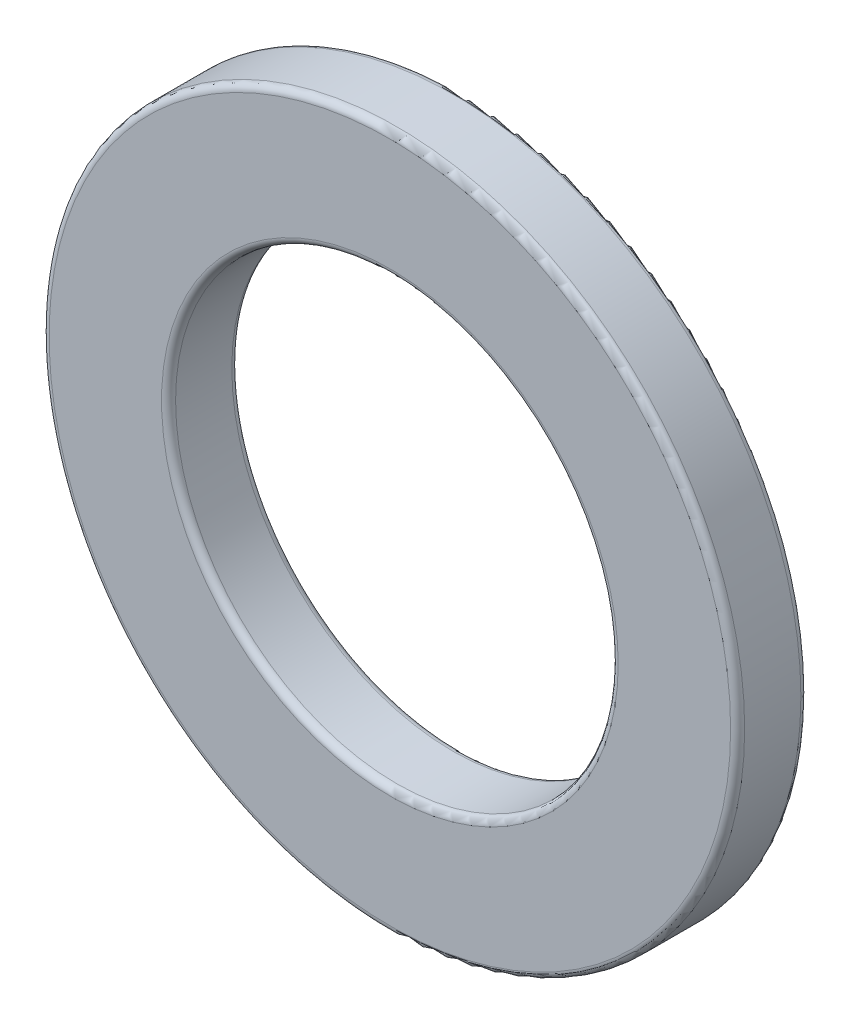
ISO-10303-21;
HEADER;
FILE_DESCRIPTION(('STEP AP214'),'2;1');
FILE_NAME('part.step','',(''),(''),'','','');
FILE_SCHEMA(('AUTOMOTIVE_DESIGN { 1 0 10303 214 1 1 1 1 }'));
ENDSEC;
DATA;
#1=APPLICATION_CONTEXT('core data for automotive mechanical design processes');
#2=APPLICATION_PROTOCOL_DEFINITION('international standard','automotive_design',2000,#1);
#3=PRODUCT_CONTEXT('',#1,'mechanical');
#4=PRODUCT('Part','Part','',(#3));
#5=PRODUCT_RELATED_PRODUCT_CATEGORY('part','',(#4));
#6=PRODUCT_DEFINITION_FORMATION('','',#4);
#7=PRODUCT_DEFINITION_CONTEXT('part definition',#1,'design');
#8=PRODUCT_DEFINITION('design','',#6,#7);
#9=PRODUCT_DEFINITION_SHAPE('','',#8);
#10=(LENGTH_UNIT() NAMED_UNIT(*) SI_UNIT(.MILLI.,.METRE.));
#11=(NAMED_UNIT(*) PLANE_ANGLE_UNIT() SI_UNIT($,.RADIAN.));
#12=(NAMED_UNIT(*) SI_UNIT($,.STERADIAN.) SOLID_ANGLE_UNIT());
#13=UNCERTAINTY_MEASURE_WITH_UNIT(LENGTH_MEASURE(1.E-05),#10,'distance_accuracy_value','');
#14=(GEOMETRIC_REPRESENTATION_CONTEXT(3) GLOBAL_UNCERTAINTY_ASSIGNED_CONTEXT((#13)) GLOBAL_UNIT_ASSIGNED_CONTEXT((#10,
#11,#12)) REPRESENTATION_CONTEXT('',''));
#15=CARTESIAN_POINT('',(0.,0.,0.));
#16=DIRECTION('',(0.,0.,1.));
#17=DIRECTION('',(1.,0.,0.));
#18=AXIS2_PLACEMENT_3D('',#15,#16,#17);
#19=CARTESIAN_POINT('',(0.,0.,0.5));
#20=DIRECTION('',(0.,0.,1.));
#21=DIRECTION('',(1.,0.,0.));
#22=AXIS2_PLACEMENT_3D('',#19,#20,#21);
#23=PLANE('',#22);
#24=CARTESIAN_POINT('',(0.,0.,0.5));
#25=DIRECTION('',(0.,0.,1.));
#26=DIRECTION('',(1.,0.,0.));
#27=AXIS2_PLACEMENT_3D('',#24,#25,#26);
#28=CIRCLE('',#27,1.625);
#29=CARTESIAN_POINT('',(1.625,0.,0.5));
#30=VERTEX_POINT('',#29);
#31=EDGE_CURVE('E10',#30,#30,#28,.F.);
#32=ORIENTED_EDGE('',*,*,#31,.T.);
#33=EDGE_LOOP('',(#32));
#34=FACE_BOUND('',#33,.T.);
#35=CARTESIAN_POINT('',(0.,0.,0.5));
#36=DIRECTION('',(0.,0.,1.));
#37=DIRECTION('',(1.,0.,0.));
#38=AXIS2_PLACEMENT_3D('',#35,#36,#37);
#39=CIRCLE('',#38,2.425);
#40=CARTESIAN_POINT('',(2.425,0.,0.5));
#41=VERTEX_POINT('',#40);
#42=EDGE_CURVE('E39',#41,#41,#39,.T.);
#43=ORIENTED_EDGE('',*,*,#42,.T.);
#44=EDGE_LOOP('',(#43));
#45=FACE_BOUND('',#44,.T.);
#46=ADVANCED_FACE('F32',(#34,#45),#23,.T.);
#47=CARTESIAN_POINT('',(0.,0.,0.));
#48=DIRECTION('',(0.,0.,1.));
#49=DIRECTION('',(1.,0.,0.));
#50=AXIS2_PLACEMENT_3D('',#47,#48,#49);
#51=PLANE('',#50);
#52=CARTESIAN_POINT('',(0.,0.,0.));
#53=DIRECTION('',(0.,0.,1.));
#54=DIRECTION('',(1.,0.,0.));
#55=AXIS2_PLACEMENT_3D('',#52,#53,#54);
#56=CIRCLE('',#55,1.625);
#57=CARTESIAN_POINT('',(1.625,0.,0.));
#58=VERTEX_POINT('',#57);
#59=EDGE_CURVE('E58',#58,#58,#56,.T.);
#60=ORIENTED_EDGE('',*,*,#59,.T.);
#61=EDGE_LOOP('',(#60));
#62=FACE_BOUND('',#61,.T.);
#63=CARTESIAN_POINT('',(0.,0.,0.));
#64=DIRECTION('',(0.,0.,1.));
#65=DIRECTION('',(1.,0.,0.));
#66=AXIS2_PLACEMENT_3D('',#63,#64,#65);
#67=CIRCLE('',#66,2.425);
#68=CARTESIAN_POINT('',(2.425,0.,0.));
#69=VERTEX_POINT('',#68);
#70=EDGE_CURVE('E61',#69,#69,#67,.F.);
#71=ORIENTED_EDGE('',*,*,#70,.T.);
#72=EDGE_LOOP('',(#71));
#73=FACE_BOUND('',#72,.T.);
#74=ADVANCED_FACE('F65',(#62,#73),#51,.F.);
#75=CARTESIAN_POINT('',(0.,0.,0.5));
#76=DIRECTION('',(0.,0.,-1.));
#77=DIRECTION('',(-1.,0.,0.));
#78=AXIS2_PLACEMENT_3D('',#75,#76,#77);
#79=CYLINDRICAL_SURFACE('',#78,2.475);
#80=CARTESIAN_POINT('',(0.,0.,0.05));
#81=DIRECTION('',(0.,0.,1.));
#82=DIRECTION('',(1.,0.,0.));
#83=AXIS2_PLACEMENT_3D('',#80,#81,#82);
#84=CIRCLE('',#83,2.475);
#85=CARTESIAN_POINT('',(2.475,0.,0.05));
#86=VERTEX_POINT('',#85);
#87=EDGE_CURVE('E43',#86,#86,#84,.T.);
#88=ORIENTED_EDGE('',*,*,#87,.T.);
#89=EDGE_LOOP('',(#88));
#90=FACE_BOUND('',#89,.T.);
#91=CARTESIAN_POINT('',(0.,0.,0.45));
#92=DIRECTION('',(0.,0.,1.));
#93=DIRECTION('',(1.,0.,0.));
#94=AXIS2_PLACEMENT_3D('',#91,#92,#93);
#95=CIRCLE('',#94,2.475);
#96=CARTESIAN_POINT('',(2.475,0.,0.45));
#97=VERTEX_POINT('',#96);
#98=EDGE_CURVE('E47',#97,#97,#95,.F.);
#99=ORIENTED_EDGE('',*,*,#98,.T.);
#100=EDGE_LOOP('',(#99));
#101=FACE_BOUND('',#100,.T.);
#102=ADVANCED_FACE('F75',(#90,#101),#79,.T.);
#103=CARTESIAN_POINT('',(0.,0.,0.5));
#104=DIRECTION('',(0.,0.,-1.));
#105=DIRECTION('',(-1.,0.,0.));
#106=AXIS2_PLACEMENT_3D('',#103,#104,#105);
#107=CYLINDRICAL_SURFACE('',#106,1.575);
#108=CARTESIAN_POINT('',(0.,0.,0.05));
#109=DIRECTION('',(0.,0.,1.));
#110=DIRECTION('',(1.,0.,0.));
#111=AXIS2_PLACEMENT_3D('',#108,#109,#110);
#112=CIRCLE('',#111,1.575);
#113=CARTESIAN_POINT('',(1.575,0.,0.05));
#114=VERTEX_POINT('',#113);
#115=EDGE_CURVE('E52',#114,#114,#112,.F.);
#116=ORIENTED_EDGE('',*,*,#115,.T.);
#117=EDGE_LOOP('',(#116));
#118=FACE_BOUND('',#117,.T.);
#119=CARTESIAN_POINT('',(0.,0.,0.45));
#120=DIRECTION('',(0.,0.,1.));
#121=DIRECTION('',(1.,0.,0.));
#122=AXIS2_PLACEMENT_3D('',#119,#120,#121);
#123=CIRCLE('',#122,1.575);
#124=CARTESIAN_POINT('',(1.575,0.,0.45));
#125=VERTEX_POINT('',#124);
#126=EDGE_CURVE('E55',#125,#125,#123,.T.);
#127=ORIENTED_EDGE('',*,*,#126,.T.);
#128=EDGE_LOOP('',(#127));
#129=FACE_BOUND('',#128,.T.);
#130=ADVANCED_FACE('F78',(#118,#129),#107,.F.);
#131=CARTESIAN_POINT('',(0.,0.,0.05));
#132=DIRECTION('',(0.,0.,1.));
#133=DIRECTION('',(1.,0.,0.));
#134=AXIS2_PLACEMENT_3D('',#131,#132,#133);
#135=TOROIDAL_SURFACE('',#134,1.625,0.05);
#136=ORIENTED_EDGE('',*,*,#115,.F.);
#137=EDGE_LOOP('',(#136));
#138=FACE_BOUND('',#137,.T.);
#139=ORIENTED_EDGE('',*,*,#59,.F.);
#140=EDGE_LOOP('',(#139));
#141=FACE_BOUND('',#140,.T.);
#142=ADVANCED_FACE('F71',(#138,#141),#135,.T.);
#143=CARTESIAN_POINT('',(0.,0.,0.05));
#144=DIRECTION('',(0.,0.,1.));
#145=DIRECTION('',(1.,0.,0.));
#146=AXIS2_PLACEMENT_3D('',#143,#144,#145);
#147=TOROIDAL_SURFACE('',#146,2.425,0.05);
#148=ORIENTED_EDGE('',*,*,#70,.F.);
#149=EDGE_LOOP('',(#148));
#150=FACE_BOUND('',#149,.T.);
#151=ORIENTED_EDGE('',*,*,#87,.F.);
#152=EDGE_LOOP('',(#151));
#153=FACE_BOUND('',#152,.T.);
#154=ADVANCED_FACE('F67',(#150,#153),#147,.T.);
#155=CARTESIAN_POINT('',(0.,0.,0.45));
#156=DIRECTION('',(0.,0.,1.));
#157=DIRECTION('',(1.,0.,0.));
#158=AXIS2_PLACEMENT_3D('',#155,#156,#157);
#159=TOROIDAL_SURFACE('',#158,1.625,0.05);
#160=ORIENTED_EDGE('',*,*,#31,.F.);
#161=EDGE_LOOP('',(#160));
#162=FACE_BOUND('',#161,.T.);
#163=ORIENTED_EDGE('',*,*,#126,.F.);
#164=EDGE_LOOP('',(#163));
#165=FACE_BOUND('',#164,.T.);
#166=ADVANCED_FACE('F70',(#162,#165),#159,.T.);
#167=CARTESIAN_POINT('',(0.,0.,0.45));
#168=DIRECTION('',(0.,0.,1.));
#169=DIRECTION('',(1.,0.,0.));
#170=AXIS2_PLACEMENT_3D('',#167,#168,#169);
#171=TOROIDAL_SURFACE('',#170,2.425,0.05);
#172=ORIENTED_EDGE('',*,*,#98,.F.);
#173=EDGE_LOOP('',(#172));
#174=FACE_BOUND('',#173,.T.);
#175=ORIENTED_EDGE('',*,*,#42,.F.);
#176=EDGE_LOOP('',(#175));
#177=FACE_BOUND('',#176,.T.);
#178=ADVANCED_FACE('F34',(#174,#177),#171,.T.);
#179=CLOSED_SHELL('',(#46,#74,#102,#130,#142,#154,#166,#178));
#180=MANIFOLD_SOLID_BREP('B2',#179);
#181=ADVANCED_BREP_SHAPE_REPRESENTATION('',(#18,#180),#14);
#182=SHAPE_DEFINITION_REPRESENTATION(#9,#181);
ENDSEC;
END-ISO-10303-21;
